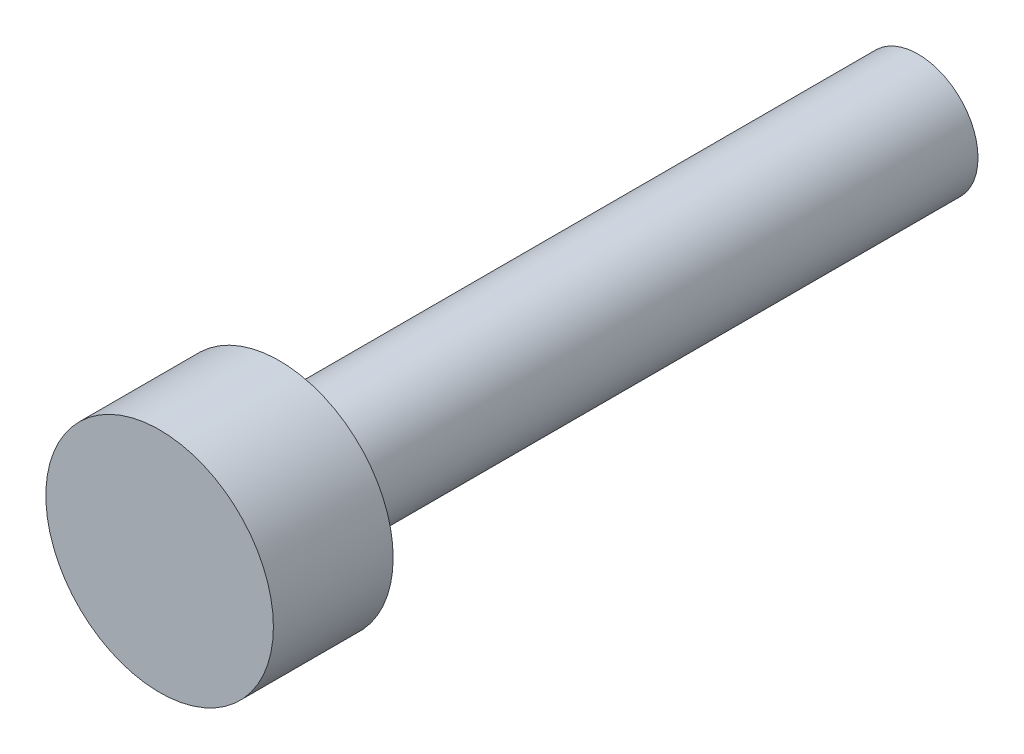
ISO-10303-21;
HEADER;
FILE_DESCRIPTION(('STEP AP214'),'2;1');
FILE_NAME('part.step','',(''),(''),'','','');
FILE_SCHEMA(('AUTOMOTIVE_DESIGN { 1 0 10303 214 1 1 1 1 }'));
ENDSEC;
DATA;
#1=APPLICATION_CONTEXT('core data for automotive mechanical design processes');
#2=APPLICATION_PROTOCOL_DEFINITION('international standard','automotive_design',2000,#1);
#3=PRODUCT_CONTEXT('',#1,'mechanical');
#4=PRODUCT('Part','Part','',(#3));
#5=PRODUCT_RELATED_PRODUCT_CATEGORY('part','',(#4));
#6=PRODUCT_DEFINITION_FORMATION('','',#4);
#7=PRODUCT_DEFINITION_CONTEXT('part definition',#1,'design');
#8=PRODUCT_DEFINITION('design','',#6,#7);
#9=PRODUCT_DEFINITION_SHAPE('','',#8);
#10=(LENGTH_UNIT() NAMED_UNIT(*) SI_UNIT(.MILLI.,.METRE.));
#11=(NAMED_UNIT(*) PLANE_ANGLE_UNIT() SI_UNIT($,.RADIAN.));
#12=(NAMED_UNIT(*) SI_UNIT($,.STERADIAN.) SOLID_ANGLE_UNIT());
#13=UNCERTAINTY_MEASURE_WITH_UNIT(LENGTH_MEASURE(1.E-05),#10,'distance_accuracy_value','');
#14=(GEOMETRIC_REPRESENTATION_CONTEXT(3) GLOBAL_UNCERTAINTY_ASSIGNED_CONTEXT((#13)) GLOBAL_UNIT_ASSIGNED_CONTEXT((#10,
#11,#12)) REPRESENTATION_CONTEXT('',''));
#15=CARTESIAN_POINT('',(0.,0.,0.));
#16=DIRECTION('',(0.,0.,1.));
#17=DIRECTION('',(1.,0.,0.));
#18=AXIS2_PLACEMENT_3D('',#15,#16,#17);
#19=CARTESIAN_POINT('',(0.,0.,16.));
#20=DIRECTION('',(0.,0.,-1.));
#21=DIRECTION('',(-1.,0.,0.));
#22=AXIS2_PLACEMENT_3D('',#19,#20,#21);
#23=CYLINDRICAL_SURFACE('',#22,1.5);
#24=CARTESIAN_POINT('',(0.,0.,16.));
#25=DIRECTION('',(0.,0.,1.));
#26=DIRECTION('',(1.,0.,0.));
#27=AXIS2_PLACEMENT_3D('',#24,#25,#26);
#28=CIRCLE('',#27,1.5);
#29=CARTESIAN_POINT('',(1.5,0.,16.));
#30=VERTEX_POINT('',#29);
#31=EDGE_CURVE('E10',#30,#30,#28,.T.);
#32=ORIENTED_EDGE('',*,*,#31,.F.);
#33=EDGE_LOOP('',(#32));
#34=FACE_BOUND('',#33,.T.);
#35=CARTESIAN_POINT('',(0.,0.,0.));
#36=DIRECTION('',(0.,0.,1.));
#37=DIRECTION('',(1.,0.,0.));
#38=AXIS2_PLACEMENT_3D('',#35,#36,#37);
#39=CIRCLE('',#38,1.5);
#40=CARTESIAN_POINT('',(1.5,0.,0.));
#41=VERTEX_POINT('',#40);
#42=EDGE_CURVE('E36',#41,#41,#39,.T.);
#43=ORIENTED_EDGE('',*,*,#42,.T.);
#44=EDGE_LOOP('',(#43));
#45=FACE_BOUND('',#44,.T.);
#46=ADVANCED_FACE('F33',(#34,#45),#23,.T.);
#47=CARTESIAN_POINT('',(0.,0.,0.));
#48=DIRECTION('',(0.,0.,1.));
#49=DIRECTION('',(1.,0.,0.));
#50=AXIS2_PLACEMENT_3D('',#47,#48,#49);
#51=PLANE('',#50);
#52=ORIENTED_EDGE('',*,*,#42,.F.);
#53=EDGE_LOOP('',(#52));
#54=FACE_BOUND('',#53,.T.);
#55=ADVANCED_FACE('F56',(#54),#51,.F.);
#56=CARTESIAN_POINT('',(0.,0.,19.));
#57=DIRECTION('',(0.,0.,-1.));
#58=DIRECTION('',(-1.,0.,0.));
#59=AXIS2_PLACEMENT_3D('',#56,#57,#58);
#60=CYLINDRICAL_SURFACE('',#59,2.85);
#61=CARTESIAN_POINT('',(0.,0.,19.));
#62=DIRECTION('',(0.,0.,1.));
#63=DIRECTION('',(1.,0.,0.));
#64=AXIS2_PLACEMENT_3D('',#61,#62,#63);
#65=CIRCLE('',#64,2.85);
#66=CARTESIAN_POINT('',(2.85,0.,19.));
#67=VERTEX_POINT('',#66);
#68=EDGE_CURVE('E43',#67,#67,#65,.T.);
#69=ORIENTED_EDGE('',*,*,#68,.F.);
#70=EDGE_LOOP('',(#69));
#71=FACE_BOUND('',#70,.T.);
#72=CARTESIAN_POINT('',(0.,0.,16.));
#73=DIRECTION('',(0.,0.,1.));
#74=DIRECTION('',(1.,0.,0.));
#75=AXIS2_PLACEMENT_3D('',#72,#73,#74);
#76=CIRCLE('',#75,2.85);
#77=CARTESIAN_POINT('',(2.85,0.,16.));
#78=VERTEX_POINT('',#77);
#79=EDGE_CURVE('E45',#78,#78,#76,.T.);
#80=ORIENTED_EDGE('',*,*,#79,.T.);
#81=EDGE_LOOP('',(#80));
#82=FACE_BOUND('',#81,.T.);
#83=ADVANCED_FACE('F53',(#71,#82),#60,.T.);
#84=CARTESIAN_POINT('',(0.,0.,19.));
#85=DIRECTION('',(0.,0.,1.));
#86=DIRECTION('',(1.,0.,0.));
#87=AXIS2_PLACEMENT_3D('',#84,#85,#86);
#88=PLANE('',#87);
#89=ORIENTED_EDGE('',*,*,#68,.T.);
#90=EDGE_LOOP('',(#89));
#91=FACE_BOUND('',#90,.T.);
#92=ADVANCED_FACE('F51',(#91),#88,.T.);
#93=CARTESIAN_POINT('',(0.,0.,16.));
#94=DIRECTION('',(0.,0.,1.));
#95=DIRECTION('',(1.,0.,0.));
#96=AXIS2_PLACEMENT_3D('',#93,#94,#95);
#97=PLANE('',#96);
#98=ORIENTED_EDGE('',*,*,#31,.T.);
#99=EDGE_LOOP('',(#98));
#100=FACE_BOUND('',#99,.T.);
#101=ORIENTED_EDGE('',*,*,#79,.F.);
#102=EDGE_LOOP('',(#101));
#103=FACE_BOUND('',#102,.T.);
#104=ADVANCED_FACE('F60',(#100,#103),#97,.F.);
#105=CLOSED_SHELL('',(#46,#55,#83,#92,#104));
#106=MANIFOLD_SOLID_BREP('B2',#105);
#107=ADVANCED_BREP_SHAPE_REPRESENTATION('',(#18,#106),#14);
#108=SHAPE_DEFINITION_REPRESENTATION(#9,#107);
ENDSEC;
END-ISO-10303-21;
